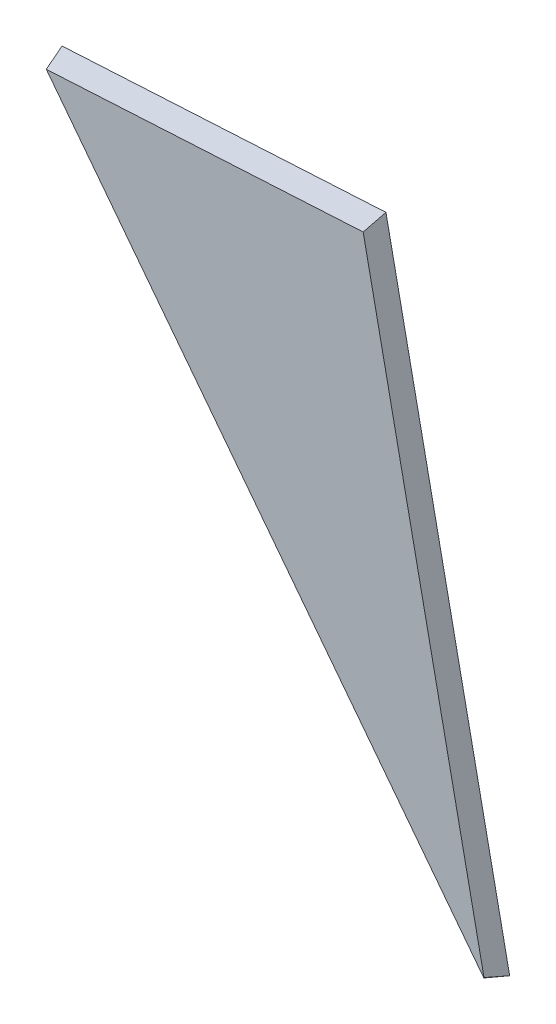
ISO-10303-21;
HEADER;
FILE_DESCRIPTION(('STEP AP214'),'2;1');
FILE_NAME('part.step','',(''),(''),'','','');
FILE_SCHEMA(('AUTOMOTIVE_DESIGN { 1 0 10303 214 1 1 1 1 }'));
ENDSEC;
DATA;
#1=APPLICATION_CONTEXT('core data for automotive mechanical design processes');
#2=APPLICATION_PROTOCOL_DEFINITION('international standard','automotive_design',2000,#1);
#3=PRODUCT_CONTEXT('',#1,'mechanical');
#4=PRODUCT('Part','Part','',(#3));
#5=PRODUCT_RELATED_PRODUCT_CATEGORY('part','',(#4));
#6=PRODUCT_DEFINITION_FORMATION('','',#4);
#7=PRODUCT_DEFINITION_CONTEXT('part definition',#1,'design');
#8=PRODUCT_DEFINITION('design','',#6,#7);
#9=PRODUCT_DEFINITION_SHAPE('','',#8);
#10=(LENGTH_UNIT() NAMED_UNIT(*) SI_UNIT(.MILLI.,.METRE.));
#11=(NAMED_UNIT(*) PLANE_ANGLE_UNIT() SI_UNIT($,.RADIAN.));
#12=(NAMED_UNIT(*) SI_UNIT($,.STERADIAN.) SOLID_ANGLE_UNIT());
#13=UNCERTAINTY_MEASURE_WITH_UNIT(LENGTH_MEASURE(1.E-05),#10,'distance_accuracy_value','');
#14=(GEOMETRIC_REPRESENTATION_CONTEXT(3) GLOBAL_UNCERTAINTY_ASSIGNED_CONTEXT((#13)) GLOBAL_UNIT_ASSIGNED_CONTEXT((#10,
#11,#12)) REPRESENTATION_CONTEXT('',''));
#15=CARTESIAN_POINT('',(0.,0.,0.));
#16=DIRECTION('',(0.,0.,1.));
#17=DIRECTION('',(1.,0.,0.));
#18=AXIS2_PLACEMENT_3D('',#15,#16,#17);
#19=CARTESIAN_POINT('',(0.,0.,60.));
#20=DIRECTION('',(0.,0.,-1.));
#21=DIRECTION('',(-1.,0.,0.));
#22=AXIS2_PLACEMENT_3D('',#19,#20,#21);
#23=PLANE('',#22);
#24=DIRECTION('',(0.308545213831799,0.951209677737506,0.));
#25=VECTOR('',#24,1.);
#26=CARTESIAN_POINT('',(523.22907497545,-169.720547004217,60.));
#27=LINE('',#26,#25);
#28=CARTESIAN_POINT('',(276.3644984007,-930.775860137303,60.));
#29=VERTEX_POINT('',#28);
#30=CARTESIAN_POINT('',(276.74440758168,-929.604643494132,60.));
#31=VERTEX_POINT('',#30);
#32=EDGE_CURVE('E100',#29,#31,#27,.T.);
#33=ORIENTED_EDGE('',*,*,#32,.T.);
#34=DIRECTION('',(-0.202202483851386,0.979343737165011,0.));
#35=VECTOR('',#34,1.);
#36=CARTESIAN_POINT('',(-31.0419403017609,561.122010517114,60.));
#37=LINE('',#36,#35);
#38=CARTESIAN_POINT('',(-28.6063593792349,549.325563325162,60.));
#39=VERTEX_POINT('',#38);
#40=EDGE_CURVE('E59',#31,#39,#37,.T.);
#41=ORIENTED_EDGE('',*,*,#40,.T.);
#42=DIRECTION('',(-0.998473286091908,-0.0552367356098018,0.));
#43=VECTOR('',#42,1.);
#44=CARTESIAN_POINT('',(-30.3839066761003,549.22722728409,60.));
#45=LINE('',#44,#43);
#46=CARTESIAN_POINT('',(-829.254457708692,505.032753552539,60.));
#47=VERTEX_POINT('',#46);
#48=EDGE_CURVE('E66',#39,#47,#45,.T.);
#49=ORIENTED_EDGE('',*,*,#48,.T.);
#50=DIRECTION('',(0.610109647488099,-0.792316993407277,0.));
#51=VECTOR('',#50,1.);
#52=CARTESIAN_POINT('',(-276.444979653998,-212.87155329238,60.));
#53=LINE('',#52,#51);
#54=EDGE_CURVE('E103',#47,#29,#53,.T.);
#55=ORIENTED_EDGE('',*,*,#54,.T.);
#56=EDGE_LOOP('',(#33,#41,#49,#55));
#57=FACE_BOUND('',#56,.T.);
#58=ADVANCED_FACE('F44',(#57),#23,.F.);
#59=CARTESIAN_POINT('',(0.,0.,0.));
#60=DIRECTION('',(0.,0.,-1.));
#61=DIRECTION('',(-1.,0.,0.));
#62=AXIS2_PLACEMENT_3D('',#59,#60,#61);
#63=PLANE('',#62);
#64=DIRECTION('',(-0.202202483851386,0.979343737165011,0.));
#65=VECTOR('',#64,1.);
#66=CARTESIAN_POINT('',(-31.0419403017609,561.122010517114,0.));
#67=LINE('',#66,#65);
#68=CARTESIAN_POINT('',(281.615569426732,-953.197537878031,0.));
#69=VERTEX_POINT('',#68);
#70=CARTESIAN_POINT('',(-31.0419403017609,561.122010517114,0.));
#71=VERTEX_POINT('',#70);
#72=EDGE_CURVE('E82',#69,#71,#67,.T.);
#73=ORIENTED_EDGE('',*,*,#72,.F.);
#74=DIRECTION('',(0.610109647488099,-0.792316993407277,0.));
#75=VECTOR('',#74,1.);
#76=CARTESIAN_POINT('',(281.615569426732,-953.197537878031,0.));
#77=LINE('',#76,#75);
#78=CARTESIAN_POINT('',(-849.589927608854,515.838957491439,0.));
#79=VERTEX_POINT('',#78);
#80=EDGE_CURVE('E95',#79,#69,#77,.T.);
#81=ORIENTED_EDGE('',*,*,#80,.F.);
#82=DIRECTION('',(-0.998473286091908,-0.0552367356098018,0.));
#83=VECTOR('',#82,1.);
#84=CARTESIAN_POINT('',(-849.589927608854,515.838957491439,0.));
#85=LINE('',#84,#83);
#86=EDGE_CURVE('E97',#71,#79,#85,.T.);
#87=ORIENTED_EDGE('',*,*,#86,.F.);
#88=EDGE_LOOP('',(#73,#81,#87));
#89=FACE_BOUND('',#88,.T.);
#90=ADVANCED_FACE('F93',(#89),#63,.T.);
#91=CARTESIAN_POINT('',(-30.3839066761003,549.22722728409,60.));
#92=DIRECTION('',(0.054179135509839,-0.979355837612682,-0.19474795148953));
#93=DIRECTION('',(-0.998473286091908,-0.0552367356098018,0.));
#94=AXIS2_PLACEMENT_3D('',#91,#92,#93);
#95=PLANE('',#94);
#96=DIRECTION('',(-0.0397989429395293,0.192761457580623,-0.980438200302441));
#97=VECTOR('',#96,1.);
#98=CARTESIAN_POINT('',(-28.6084205308629,549.335546268496,59.9492239832648));
#99=LINE('',#98,#97);
#100=EDGE_CURVE('E88',#71,#39,#99,.F.);
#101=ORIENTED_EDGE('',*,*,#100,.F.);
#102=ORIENTED_EDGE('',*,*,#86,.T.);
#103=DIRECTION('',(0.316419420475128,-0.16814427228237,0.933598550794085));
#104=VECTOR('',#103,1.);
#105=CARTESIAN_POINT('',(-751.621867610542,463.779042424922,289.055705560655));
#106=LINE('',#105,#104);
#107=EDGE_CURVE('E12',#79,#47,#106,.T.);
#108=ORIENTED_EDGE('',*,*,#107,.T.);
#109=ORIENTED_EDGE('',*,*,#48,.F.);
#110=EDGE_LOOP('',(#101,#102,#108,#109));
#111=FACE_BOUND('',#110,.T.);
#112=ADVANCED_FACE('F112',(#111),#95,.F.);
#113=CARTESIAN_POINT('',(523.22907497545,-169.720547004217,60.));
#114=DIRECTION('',(-0.932997170442229,0.30263759736263,-0.194747951489534));
#115=DIRECTION('',(0.308545213831799,0.951209677737506,0.));
#116=AXIS2_PLACEMENT_3D('',#113,#114,#115);
#117=PLANE('',#116);
#118=DIRECTION('',(-0.0753400817710299,0.364900746195518,0.927993166733834));
#119=VECTOR('',#118,1.);
#120=CARTESIAN_POINT('',(257.253016900333,-835.200405579605,300.083059869807));
#121=LINE('',#120,#119);
#122=EDGE_CURVE('E79',#31,#69,#121,.F.);
#123=ORIENTED_EDGE('',*,*,#122,.F.);
#124=ORIENTED_EDGE('',*,*,#32,.F.);
#125=DIRECTION('',(0.0817065383336703,-0.348880764085259,-0.933598550794084));
#126=VECTOR('',#125,1.);
#127=CARTESIAN_POINT('',(256.318035420419,-845.1789732247,289.055705560657));
#128=LINE('',#127,#126);
#129=EDGE_CURVE('E52',#29,#69,#128,.T.);
#130=ORIENTED_EDGE('',*,*,#129,.T.);
#131=EDGE_LOOP('',(#123,#124,#130));
#132=FACE_BOUND('',#131,.T.);
#133=ADVANCED_FACE('F99',(#132),#117,.F.);
#134=CARTESIAN_POINT('',(-276.444979653998,-212.87155329238,60.));
#135=DIRECTION('',(0.782529780721693,0.602573177954846,-0.156693035879251));
#136=DIRECTION('',(0.610109647488099,-0.792316993407277,0.));
#137=AXIS2_PLACEMENT_3D('',#134,#135,#136);
#138=PLANE('',#137);
#139=ORIENTED_EDGE('',*,*,#107,.F.);
#140=ORIENTED_EDGE('',*,*,#80,.T.);
#141=ORIENTED_EDGE('',*,*,#129,.F.);
#142=ORIENTED_EDGE('',*,*,#54,.F.);
#143=EDGE_LOOP('',(#139,#140,#141,#142));
#144=FACE_BOUND('',#143,.T.);
#145=ADVANCED_FACE('F46',(#144),#138,.F.);
#146=CARTESIAN_POINT('',(-31.0419403017609,561.122010517114,60.));
#147=DIRECTION('',(-0.979343737165011,-0.202202483851386,0.));
#148=DIRECTION('',(0.202202483851386,-0.979343737165011,0.));
#149=AXIS2_PLACEMENT_3D('',#146,#147,#148);
#150=PLANE('',#149);
#151=ORIENTED_EDGE('',*,*,#100,.T.);
#152=ORIENTED_EDGE('',*,*,#40,.F.);
#153=ORIENTED_EDGE('',*,*,#122,.T.);
#154=ORIENTED_EDGE('',*,*,#72,.T.);
#155=EDGE_LOOP('',(#151,#152,#153,#154));
#156=FACE_BOUND('',#155,.T.);
#157=ADVANCED_FACE('F81',(#156),#150,.F.);
#158=CLOSED_SHELL('',(#58,#90,#112,#133,#145,#157));
#159=MANIFOLD_SOLID_BREP('B2',#158);
#160=ADVANCED_BREP_SHAPE_REPRESENTATION('',(#18,#159),#14);
#161=SHAPE_DEFINITION_REPRESENTATION(#9,#160);
ENDSEC;
END-ISO-10303-21;
